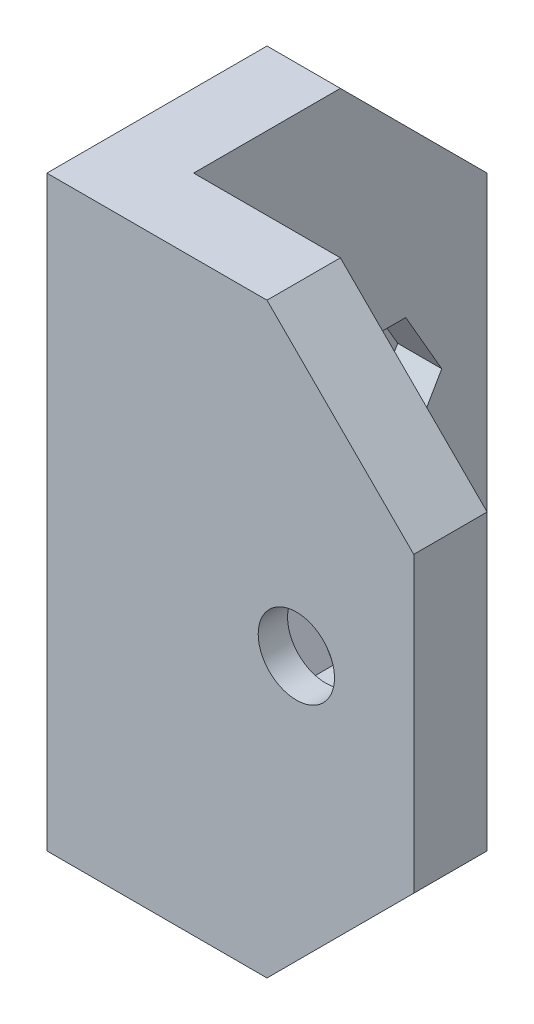
ISO-10303-21;
HEADER;
FILE_DESCRIPTION(('STEP AP214'),'2;1');
FILE_NAME('part.step','',(''),(''),'','','');
FILE_SCHEMA(('AUTOMOTIVE_DESIGN { 1 0 10303 214 1 1 1 1 }'));
ENDSEC;
DATA;
#1=APPLICATION_CONTEXT('core data for automotive mechanical design processes');
#2=APPLICATION_PROTOCOL_DEFINITION('international standard','automotive_design',2000,#1);
#3=PRODUCT_CONTEXT('',#1,'mechanical');
#4=PRODUCT('Part','Part','',(#3));
#5=PRODUCT_RELATED_PRODUCT_CATEGORY('part','',(#4));
#6=PRODUCT_DEFINITION_FORMATION('','',#4);
#7=PRODUCT_DEFINITION_CONTEXT('part definition',#1,'design');
#8=PRODUCT_DEFINITION('design','',#6,#7);
#9=PRODUCT_DEFINITION_SHAPE('','',#8);
#10=(LENGTH_UNIT() NAMED_UNIT(*) SI_UNIT(.MILLI.,.METRE.));
#11=(NAMED_UNIT(*) PLANE_ANGLE_UNIT() SI_UNIT($,.RADIAN.));
#12=(NAMED_UNIT(*) SI_UNIT($,.STERADIAN.) SOLID_ANGLE_UNIT());
#13=UNCERTAINTY_MEASURE_WITH_UNIT(LENGTH_MEASURE(1.E-05),#10,'distance_accuracy_value','');
#14=(GEOMETRIC_REPRESENTATION_CONTEXT(3) GLOBAL_UNCERTAINTY_ASSIGNED_CONTEXT((#13)) GLOBAL_UNIT_ASSIGNED_CONTEXT((#10,
#11,#12)) REPRESENTATION_CONTEXT('',''));
#15=CARTESIAN_POINT('',(0.,0.,0.));
#16=DIRECTION('',(0.,0.,1.));
#17=DIRECTION('',(1.,0.,0.));
#18=AXIS2_PLACEMENT_3D('',#15,#16,#17);
#19=CARTESIAN_POINT('',(0.,20.,-17.));
#20=DIRECTION('',(1.,0.,0.));
#21=DIRECTION('',(0.,0.,-1.));
#22=AXIS2_PLACEMENT_3D('',#19,#20,#21);
#23=CYLINDRICAL_SURFACE('',#22,2.6);
#24=CARTESIAN_POINT('',(0.,20.,-17.));
#25=DIRECTION('',(1.,0.,0.));
#26=DIRECTION('',(0.,0.,-1.));
#27=AXIS2_PLACEMENT_3D('',#24,#25,#26);
#28=CIRCLE('',#27,2.6);
#29=CARTESIAN_POINT('',(0.,20.,-19.6));
#30=VERTEX_POINT('',#29);
#31=EDGE_CURVE('E254',#30,#30,#28,.T.);
#32=ORIENTED_EDGE('',*,*,#31,.F.);
#33=EDGE_LOOP('',(#32));
#34=FACE_BOUND('',#33,.T.);
#35=CARTESIAN_POINT('',(2.,20.,-17.));
#36=DIRECTION('',(1.,0.,0.));
#37=DIRECTION('',(0.,0.,-1.));
#38=AXIS2_PLACEMENT_3D('',#35,#36,#37);
#39=CIRCLE('',#38,2.6);
#40=CARTESIAN_POINT('',(2.,20.,-19.6));
#41=VERTEX_POINT('',#40);
#42=EDGE_CURVE('E252',#41,#41,#39,.F.);
#43=ORIENTED_EDGE('',*,*,#42,.F.);
#44=EDGE_LOOP('',(#43));
#45=FACE_BOUND('',#44,.T.);
#46=ADVANCED_FACE('F42',(#34,#45),#23,.F.);
#47=CARTESIAN_POINT('',(17.,20.,35.));
#48=DIRECTION('',(0.,0.,-1.));
#49=DIRECTION('',(-1.,0.,0.));
#50=AXIS2_PLACEMENT_3D('',#47,#48,#49);
#51=CYLINDRICAL_SURFACE('',#50,2.6);
#52=CARTESIAN_POINT('',(17.,20.,0.));
#53=DIRECTION('',(0.,0.,-1.));
#54=DIRECTION('',(-1.,0.,0.));
#55=AXIS2_PLACEMENT_3D('',#52,#53,#54);
#56=CIRCLE('',#55,2.6);
#57=CARTESIAN_POINT('',(14.4,20.,0.));
#58=VERTEX_POINT('',#57);
#59=EDGE_CURVE('E319',#58,#58,#56,.T.);
#60=ORIENTED_EDGE('',*,*,#59,.F.);
#61=EDGE_LOOP('',(#60));
#62=FACE_BOUND('',#61,.T.);
#63=CARTESIAN_POINT('',(17.,20.,-2.));
#64=DIRECTION('',(0.,0.,-1.));
#65=DIRECTION('',(-1.,0.,0.));
#66=AXIS2_PLACEMENT_3D('',#63,#64,#65);
#67=CIRCLE('',#66,2.6);
#68=CARTESIAN_POINT('',(14.4,20.,-2.));
#69=VERTEX_POINT('',#68);
#70=EDGE_CURVE('E318',#69,#69,#67,.F.);
#71=ORIENTED_EDGE('',*,*,#70,.F.);
#72=EDGE_LOOP('',(#71));
#73=FACE_BOUND('',#72,.T.);
#74=ADVANCED_FACE('F477',(#62,#73),#51,.F.);
#75=CARTESIAN_POINT('',(0.,40.,-25.));
#76=DIRECTION('',(1.,0.,0.));
#77=DIRECTION('',(0.,0.,-1.));
#78=AXIS2_PLACEMENT_3D('',#75,#76,#77);
#79=PLANE('',#78);
#80=ORIENTED_EDGE('',*,*,#31,.T.);
#81=EDGE_LOOP('',(#80));
#82=FACE_BOUND('',#81,.T.);
#83=DIRECTION('',(0.,-1.,0.));
#84=VECTOR('',#83,1.);
#85=CARTESIAN_POINT('',(0.,40.,-25.));
#86=LINE('',#85,#84);
#87=CARTESIAN_POINT('',(0.,30.,-25.));
#88=VERTEX_POINT('',#87);
#89=CARTESIAN_POINT('',(0.,10.,-25.));
#90=VERTEX_POINT('',#89);
#91=EDGE_CURVE('E339',#88,#90,#86,.T.);
#92=ORIENTED_EDGE('',*,*,#91,.T.);
#93=DIRECTION('',(0.,0.707106781186546,-0.707106781186549));
#94=VECTOR('',#93,1.);
#95=CARTESIAN_POINT('',(0.,10.,-25.));
#96=LINE('',#95,#94);
#97=CARTESIAN_POINT('',(0.,0.,-15.));
#98=VERTEX_POINT('',#97);
#99=EDGE_CURVE('E421',#90,#98,#96,.F.);
#100=ORIENTED_EDGE('',*,*,#99,.T.);
#101=DIRECTION('',(0.,0.,1.));
#102=VECTOR('',#101,1.);
#103=CARTESIAN_POINT('',(0.,0.,-25.));
#104=LINE('',#103,#102);
#105=CARTESIAN_POINT('',(0.,0.,0.));
#106=VERTEX_POINT('',#105);
#107=EDGE_CURVE('E323',#98,#106,#104,.T.);
#108=ORIENTED_EDGE('',*,*,#107,.T.);
#109=DIRECTION('',(0.,-1.,0.));
#110=VECTOR('',#109,1.);
#111=CARTESIAN_POINT('',(0.,40.,0.));
#112=LINE('',#111,#110);
#113=CARTESIAN_POINT('',(0.,40.,0.));
#114=VERTEX_POINT('',#113);
#115=EDGE_CURVE('E369',#114,#106,#112,.T.);
#116=ORIENTED_EDGE('',*,*,#115,.F.);
#117=DIRECTION('',(0.,0.,1.));
#118=VECTOR('',#117,1.);
#119=CARTESIAN_POINT('',(0.,40.,-25.));
#120=LINE('',#119,#118);
#121=CARTESIAN_POINT('',(0.,40.,-15.));
#122=VERTEX_POINT('',#121);
#123=EDGE_CURVE('E324',#122,#114,#120,.T.);
#124=ORIENTED_EDGE('',*,*,#123,.F.);
#125=DIRECTION('',(0.,-0.707106781186549,-0.707106781186546));
#126=VECTOR('',#125,1.);
#127=CARTESIAN_POINT('',(0.,40.,-15.));
#128=LINE('',#127,#126);
#129=EDGE_CURVE('E418',#122,#88,#128,.T.);
#130=ORIENTED_EDGE('',*,*,#129,.T.);
#131=EDGE_LOOP('',(#92,#100,#108,#116,#124,#130));
#132=FACE_BOUND('',#131,.T.);
#133=ADVANCED_FACE('F434',(#82,#132),#79,.F.);
#134=CARTESIAN_POINT('',(0.,40.,0.));
#135=DIRECTION('',(0.,0.,-1.));
#136=DIRECTION('',(-1.,0.,0.));
#137=AXIS2_PLACEMENT_3D('',#134,#135,#136);
#138=PLANE('',#137);
#139=ORIENTED_EDGE('',*,*,#59,.T.);
#140=EDGE_LOOP('',(#139));
#141=FACE_BOUND('',#140,.T.);
#142=DIRECTION('',(1.,0.,0.));
#143=VECTOR('',#142,1.);
#144=CARTESIAN_POINT('',(0.,0.,0.));
#145=LINE('',#144,#143);
#146=CARTESIAN_POINT('',(15.,0.,0.));
#147=VERTEX_POINT('',#146);
#148=EDGE_CURVE('E342',#106,#147,#145,.T.);
#149=ORIENTED_EDGE('',*,*,#148,.T.);
#150=DIRECTION('',(-0.707106781186549,-0.707106781186546,0.));
#151=VECTOR('',#150,1.);
#152=CARTESIAN_POINT('',(25.,10.,0.));
#153=LINE('',#152,#151);
#154=CARTESIAN_POINT('',(25.,10.,0.));
#155=VERTEX_POINT('',#154);
#156=EDGE_CURVE('E401',#147,#155,#153,.F.);
#157=ORIENTED_EDGE('',*,*,#156,.T.);
#158=DIRECTION('',(0.,-1.,0.));
#159=VECTOR('',#158,1.);
#160=CARTESIAN_POINT('',(25.,40.,0.));
#161=LINE('',#160,#159);
#162=CARTESIAN_POINT('',(25.,30.,0.));
#163=VERTEX_POINT('',#162);
#164=EDGE_CURVE('E365',#163,#155,#161,.T.);
#165=ORIENTED_EDGE('',*,*,#164,.F.);
#166=DIRECTION('',(-0.707106781186546,0.707106781186549,0.));
#167=VECTOR('',#166,1.);
#168=CARTESIAN_POINT('',(15.,40.,0.));
#169=LINE('',#168,#167);
#170=CARTESIAN_POINT('',(15.,40.,0.));
#171=VERTEX_POINT('',#170);
#172=EDGE_CURVE('E398',#163,#171,#169,.T.);
#173=ORIENTED_EDGE('',*,*,#172,.T.);
#174=DIRECTION('',(1.,0.,0.));
#175=VECTOR('',#174,1.);
#176=CARTESIAN_POINT('',(0.,40.,0.));
#177=LINE('',#176,#175);
#178=EDGE_CURVE('E327',#114,#171,#177,.T.);
#179=ORIENTED_EDGE('',*,*,#178,.F.);
#180=ORIENTED_EDGE('',*,*,#115,.T.);
#181=EDGE_LOOP('',(#149,#157,#165,#173,#179,#180));
#182=FACE_BOUND('',#181,.T.);
#183=ADVANCED_FACE('F451',(#141,#182),#138,.F.);
#184=CARTESIAN_POINT('',(25.,40.,0.));
#185=DIRECTION('',(-1.,0.,0.));
#186=DIRECTION('',(0.,0.,1.));
#187=AXIS2_PLACEMENT_3D('',#184,#185,#186);
#188=PLANE('',#187);
#189=ORIENTED_EDGE('',*,*,#164,.T.);
#190=DIRECTION('',(0.,0.,-1.));
#191=VECTOR('',#190,1.);
#192=CARTESIAN_POINT('',(25.,10.,0.));
#193=LINE('',#192,#191);
#194=CARTESIAN_POINT('',(25.,10.,-5.));
#195=VERTEX_POINT('',#194);
#196=EDGE_CURVE('E382',#155,#195,#193,.T.);
#197=ORIENTED_EDGE('',*,*,#196,.T.);
#198=DIRECTION('',(0.,-1.,0.));
#199=VECTOR('',#198,1.);
#200=CARTESIAN_POINT('',(25.,40.,-5.));
#201=LINE('',#200,#199);
#202=CARTESIAN_POINT('',(25.,30.,-5.));
#203=VERTEX_POINT('',#202);
#204=EDGE_CURVE('E361',#203,#195,#201,.T.);
#205=ORIENTED_EDGE('',*,*,#204,.F.);
#206=DIRECTION('',(0.,0.,1.));
#207=VECTOR('',#206,1.);
#208=CARTESIAN_POINT('',(25.,30.,0.));
#209=LINE('',#208,#207);
#210=EDGE_CURVE('E373',#203,#163,#209,.T.);
#211=ORIENTED_EDGE('',*,*,#210,.T.);
#212=EDGE_LOOP('',(#189,#197,#205,#211));
#213=FACE_BOUND('',#212,.T.);
#214=ADVANCED_FACE('F462',(#213),#188,.F.);
#215=CARTESIAN_POINT('',(25.,40.,-5.));
#216=DIRECTION('',(0.,0.,1.));
#217=DIRECTION('',(1.,0.,0.));
#218=AXIS2_PLACEMENT_3D('',#215,#216,#217);
#219=PLANE('',#218);
#220=DIRECTION('',(1.,0.,0.));
#221=VECTOR('',#220,1.);
#222=CARTESIAN_POINT('',(14.5462613559441,24.25,-5.));
#223=LINE('',#222,#221);
#224=CARTESIAN_POINT('',(14.5462613559441,24.25,-5.));
#225=VERTEX_POINT('',#224);
#226=CARTESIAN_POINT('',(19.4537386440559,24.25,-5.));
#227=VERTEX_POINT('',#226);
#228=EDGE_CURVE('E278',#225,#227,#223,.T.);
#229=ORIENTED_EDGE('',*,*,#228,.F.);
#230=DIRECTION('',(0.5,0.866025403784439,0.));
#231=VECTOR('',#230,1.);
#232=CARTESIAN_POINT('',(12.0925227118882,20.,-5.));
#233=LINE('',#232,#231);
#234=CARTESIAN_POINT('',(12.0925227118882,20.,-5.));
#235=VERTEX_POINT('',#234);
#236=EDGE_CURVE('E258',#235,#225,#233,.T.);
#237=ORIENTED_EDGE('',*,*,#236,.F.);
#238=DIRECTION('',(-0.5,0.866025403784439,0.));
#239=VECTOR('',#238,1.);
#240=CARTESIAN_POINT('',(14.5462613559441,15.75,-5.));
#241=LINE('',#240,#239);
#242=CARTESIAN_POINT('',(14.5462613559441,15.75,-5.));
#243=VERTEX_POINT('',#242);
#244=EDGE_CURVE('E294',#243,#235,#241,.T.);
#245=ORIENTED_EDGE('',*,*,#244,.F.);
#246=DIRECTION('',(-1.,0.,0.));
#247=VECTOR('',#246,1.);
#248=CARTESIAN_POINT('',(19.4537386440559,15.75,-5.));
#249=LINE('',#248,#247);
#250=CARTESIAN_POINT('',(19.4537386440559,15.75,-5.));
#251=VERTEX_POINT('',#250);
#252=EDGE_CURVE('E290',#251,#243,#249,.T.);
#253=ORIENTED_EDGE('',*,*,#252,.F.);
#254=DIRECTION('',(-0.5,-0.866025403784439,0.));
#255=VECTOR('',#254,1.);
#256=CARTESIAN_POINT('',(21.9074772881118,20.,-5.));
#257=LINE('',#256,#255);
#258=CARTESIAN_POINT('',(21.9074772881118,20.,-5.));
#259=VERTEX_POINT('',#258);
#260=EDGE_CURVE('E286',#259,#251,#257,.T.);
#261=ORIENTED_EDGE('',*,*,#260,.F.);
#262=DIRECTION('',(0.5,-0.866025403784439,0.));
#263=VECTOR('',#262,1.);
#264=CARTESIAN_POINT('',(19.4537386440559,24.25,-5.));
#265=LINE('',#264,#263);
#266=EDGE_CURVE('E282',#227,#259,#265,.T.);
#267=ORIENTED_EDGE('',*,*,#266,.F.);
#268=EDGE_LOOP('',(#229,#237,#245,#253,#261,#267));
#269=FACE_BOUND('',#268,.T.);
#270=ORIENTED_EDGE('',*,*,#204,.T.);
#271=DIRECTION('',(0.707106781186549,0.707106781186546,0.));
#272=VECTOR('',#271,1.);
#273=CARTESIAN_POINT('',(25.,10.,-5.));
#274=LINE('',#273,#272);
#275=CARTESIAN_POINT('',(15.,0.,-5.));
#276=VERTEX_POINT('',#275);
#277=EDGE_CURVE('E389',#195,#276,#274,.F.);
#278=ORIENTED_EDGE('',*,*,#277,.T.);
#279=DIRECTION('',(-1.,0.,0.));
#280=VECTOR('',#279,1.);
#281=CARTESIAN_POINT('',(25.,0.,-5.));
#282=LINE('',#281,#280);
#283=CARTESIAN_POINT('',(5.,0.,-5.));
#284=VERTEX_POINT('',#283);
#285=EDGE_CURVE('E346',#276,#284,#282,.T.);
#286=ORIENTED_EDGE('',*,*,#285,.T.);
#287=DIRECTION('',(0.,-1.,0.));
#288=VECTOR('',#287,1.);
#289=CARTESIAN_POINT('',(5.,40.,-5.));
#290=LINE('',#289,#288);
#291=CARTESIAN_POINT('',(5.,40.,-5.));
#292=VERTEX_POINT('',#291);
#293=EDGE_CURVE('E357',#292,#284,#290,.T.);
#294=ORIENTED_EDGE('',*,*,#293,.F.);
#295=DIRECTION('',(-1.,0.,0.));
#296=VECTOR('',#295,1.);
#297=CARTESIAN_POINT('',(25.,40.,-5.));
#298=LINE('',#297,#296);
#299=CARTESIAN_POINT('',(15.,40.,-5.));
#300=VERTEX_POINT('',#299);
#301=EDGE_CURVE('E332',#300,#292,#298,.T.);
#302=ORIENTED_EDGE('',*,*,#301,.F.);
#303=DIRECTION('',(0.707106781186546,-0.707106781186549,0.));
#304=VECTOR('',#303,1.);
#305=CARTESIAN_POINT('',(15.,40.,-5.));
#306=LINE('',#305,#304);
#307=EDGE_CURVE('E386',#300,#203,#306,.T.);
#308=ORIENTED_EDGE('',*,*,#307,.T.);
#309=EDGE_LOOP('',(#270,#278,#286,#294,#302,#308));
#310=FACE_BOUND('',#309,.T.);
#311=ADVANCED_FACE('F460',(#269,#310),#219,.F.);
#312=CARTESIAN_POINT('',(5.,40.,-5.));
#313=DIRECTION('',(-1.,0.,0.));
#314=DIRECTION('',(0.,0.,1.));
#315=AXIS2_PLACEMENT_3D('',#312,#313,#314);
#316=PLANE('',#315);
#317=DIRECTION('',(0.,0.,1.));
#318=VECTOR('',#317,1.);
#319=CARTESIAN_POINT('',(5.,24.25,-19.4537386440559));
#320=LINE('',#319,#318);
#321=CARTESIAN_POINT('',(5.,24.25,-19.4537386440559));
#322=VERTEX_POINT('',#321);
#323=CARTESIAN_POINT('',(5.,24.25,-14.5462613559441));
#324=VERTEX_POINT('',#323);
#325=EDGE_CURVE('E210',#322,#324,#320,.T.);
#326=ORIENTED_EDGE('',*,*,#325,.F.);
#327=DIRECTION('',(0.,0.866025403784439,0.5));
#328=VECTOR('',#327,1.);
#329=CARTESIAN_POINT('',(4.99999999999999,20.,-21.9074772881118));
#330=LINE('',#329,#328);
#331=CARTESIAN_POINT('',(4.99999999999999,20.,-21.9074772881118));
#332=VERTEX_POINT('',#331);
#333=EDGE_CURVE('E216',#332,#322,#330,.T.);
#334=ORIENTED_EDGE('',*,*,#333,.F.);
#335=DIRECTION('',(0.,0.866025403784439,-0.5));
#336=VECTOR('',#335,1.);
#337=CARTESIAN_POINT('',(5.,15.75,-19.4537386440559));
#338=LINE('',#337,#336);
#339=CARTESIAN_POINT('',(5.,15.75,-19.4537386440559));
#340=VERTEX_POINT('',#339);
#341=EDGE_CURVE('E232',#340,#332,#338,.T.);
#342=ORIENTED_EDGE('',*,*,#341,.F.);
#343=DIRECTION('',(0.,0.,-1.));
#344=VECTOR('',#343,1.);
#345=CARTESIAN_POINT('',(5.,15.75,-14.5462613559441));
#346=LINE('',#345,#344);
#347=CARTESIAN_POINT('',(5.,15.75,-14.5462613559441));
#348=VERTEX_POINT('',#347);
#349=EDGE_CURVE('E225',#348,#340,#346,.T.);
#350=ORIENTED_EDGE('',*,*,#349,.F.);
#351=DIRECTION('',(0.,-0.866025403784439,-0.5));
#352=VECTOR('',#351,1.);
#353=CARTESIAN_POINT('',(5.,20.,-12.0925227118882));
#354=LINE('',#353,#352);
#355=CARTESIAN_POINT('',(5.,20.,-12.0925227118882));
#356=VERTEX_POINT('',#355);
#357=EDGE_CURVE('E221',#356,#348,#354,.T.);
#358=ORIENTED_EDGE('',*,*,#357,.F.);
#359=DIRECTION('',(0.,-0.866025403784439,0.5));
#360=VECTOR('',#359,1.);
#361=CARTESIAN_POINT('',(5.,24.25,-14.5462613559441));
#362=LINE('',#361,#360);
#363=EDGE_CURVE('E198',#324,#356,#362,.T.);
#364=ORIENTED_EDGE('',*,*,#363,.F.);
#365=EDGE_LOOP('',(#326,#334,#342,#350,#358,#364));
#366=FACE_BOUND('',#365,.T.);
#367=DIRECTION('',(0.,0.,-1.));
#368=VECTOR('',#367,1.);
#369=CARTESIAN_POINT('',(5.,0.,-5.));
#370=LINE('',#369,#368);
#371=CARTESIAN_POINT('',(5.,0.,-15.));
#372=VERTEX_POINT('',#371);
#373=EDGE_CURVE('E328',#284,#372,#370,.T.);
#374=ORIENTED_EDGE('',*,*,#373,.T.);
#375=DIRECTION('',(0.,-0.707106781186546,0.707106781186549));
#376=VECTOR('',#375,1.);
#377=CARTESIAN_POINT('',(4.99999999999999,10.,-25.));
#378=LINE('',#377,#376);
#379=CARTESIAN_POINT('',(4.99999999999999,10.,-25.));
#380=VERTEX_POINT('',#379);
#381=EDGE_CURVE('E12',#372,#380,#378,.F.);
#382=ORIENTED_EDGE('',*,*,#381,.T.);
#383=DIRECTION('',(0.,-1.,0.));
#384=VECTOR('',#383,1.);
#385=CARTESIAN_POINT('',(4.99999999999999,40.,-25.));
#386=LINE('',#385,#384);
#387=CARTESIAN_POINT('',(4.99999999999999,30.,-25.));
#388=VERTEX_POINT('',#387);
#389=EDGE_CURVE('E354',#388,#380,#386,.T.);
#390=ORIENTED_EDGE('',*,*,#389,.F.);
#391=DIRECTION('',(0.,0.707106781186549,0.707106781186546));
#392=VECTOR('',#391,1.);
#393=CARTESIAN_POINT('',(5.,40.,-15.));
#394=LINE('',#393,#392);
#395=CARTESIAN_POINT('',(5.,40.,-15.));
#396=VERTEX_POINT('',#395);
#397=EDGE_CURVE('E52',#388,#396,#394,.T.);
#398=ORIENTED_EDGE('',*,*,#397,.T.);
#399=DIRECTION('',(0.,0.,-1.));
#400=VECTOR('',#399,1.);
#401=CARTESIAN_POINT('',(5.,40.,-5.));
#402=LINE('',#401,#400);
#403=EDGE_CURVE('E335',#292,#396,#402,.T.);
#404=ORIENTED_EDGE('',*,*,#403,.F.);
#405=ORIENTED_EDGE('',*,*,#293,.T.);
#406=EDGE_LOOP('',(#374,#382,#390,#398,#404,#405));
#407=FACE_BOUND('',#406,.T.);
#408=ADVANCED_FACE('F218',(#366,#407),#316,.F.);
#409=CARTESIAN_POINT('',(4.99999999999999,40.,-25.));
#410=DIRECTION('',(0.,0.,1.));
#411=DIRECTION('',(1.,0.,0.));
#412=AXIS2_PLACEMENT_3D('',#409,#410,#411);
#413=PLANE('',#412);
#414=ORIENTED_EDGE('',*,*,#389,.T.);
#415=DIRECTION('',(-1.,0.,0.));
#416=VECTOR('',#415,1.);
#417=CARTESIAN_POINT('',(4.99999999999999,10.,-25.));
#418=LINE('',#417,#416);
#419=EDGE_CURVE('E414',#380,#90,#418,.T.);
#420=ORIENTED_EDGE('',*,*,#419,.T.);
#421=ORIENTED_EDGE('',*,*,#91,.F.);
#422=DIRECTION('',(1.,0.,0.));
#423=VECTOR('',#422,1.);
#424=CARTESIAN_POINT('',(4.99999999999999,30.,-25.));
#425=LINE('',#424,#423);
#426=EDGE_CURVE('E64',#88,#388,#425,.T.);
#427=ORIENTED_EDGE('',*,*,#426,.T.);
#428=EDGE_LOOP('',(#414,#420,#421,#427));
#429=FACE_BOUND('',#428,.T.);
#430=ADVANCED_FACE('F436',(#429),#413,.F.);
#431=CARTESIAN_POINT('',(0.,40.,0.));
#432=DIRECTION('',(0.,1.,0.));
#433=DIRECTION('',(0.,0.,1.));
#434=AXIS2_PLACEMENT_3D('',#431,#432,#433);
#435=PLANE('',#434);
#436=ORIENTED_EDGE('',*,*,#178,.T.);
#437=DIRECTION('',(0.,0.,-1.));
#438=VECTOR('',#437,1.);
#439=CARTESIAN_POINT('',(15.,40.,-5.));
#440=LINE('',#439,#438);
#441=EDGE_CURVE('E408',#171,#300,#440,.T.);
#442=ORIENTED_EDGE('',*,*,#441,.T.);
#443=ORIENTED_EDGE('',*,*,#301,.T.);
#444=ORIENTED_EDGE('',*,*,#403,.T.);
#445=DIRECTION('',(-1.,0.,0.));
#446=VECTOR('',#445,1.);
#447=CARTESIAN_POINT('',(0.,40.,-15.));
#448=LINE('',#447,#446);
#449=EDGE_CURVE('E404',#396,#122,#448,.T.);
#450=ORIENTED_EDGE('',*,*,#449,.T.);
#451=ORIENTED_EDGE('',*,*,#123,.T.);
#452=EDGE_LOOP('',(#436,#442,#443,#444,#450,#451));
#453=FACE_BOUND('',#452,.T.);
#454=ADVANCED_FACE('F429',(#453),#435,.T.);
#455=CARTESIAN_POINT('',(0.,0.,0.));
#456=DIRECTION('',(0.,1.,0.));
#457=DIRECTION('',(0.,0.,1.));
#458=AXIS2_PLACEMENT_3D('',#455,#456,#457);
#459=PLANE('',#458);
#460=ORIENTED_EDGE('',*,*,#285,.F.);
#461=DIRECTION('',(0.,0.,1.));
#462=VECTOR('',#461,1.);
#463=CARTESIAN_POINT('',(15.,0.,0.));
#464=LINE('',#463,#462);
#465=EDGE_CURVE('E395',#276,#147,#464,.T.);
#466=ORIENTED_EDGE('',*,*,#465,.T.);
#467=ORIENTED_EDGE('',*,*,#148,.F.);
#468=ORIENTED_EDGE('',*,*,#107,.F.);
#469=DIRECTION('',(1.,0.,0.));
#470=VECTOR('',#469,1.);
#471=CARTESIAN_POINT('',(0.,0.,-15.));
#472=LINE('',#471,#470);
#473=EDGE_CURVE('E392',#98,#372,#472,.T.);
#474=ORIENTED_EDGE('',*,*,#473,.T.);
#475=ORIENTED_EDGE('',*,*,#373,.F.);
#476=EDGE_LOOP('',(#460,#466,#467,#468,#474,#475));
#477=FACE_BOUND('',#476,.T.);
#478=ADVANCED_FACE('F445',(#477),#459,.F.);
#479=CARTESIAN_POINT('',(0.,40.,-2.));
#480=DIRECTION('',(0.,0.,-1.));
#481=DIRECTION('',(-1.,0.,0.));
#482=AXIS2_PLACEMENT_3D('',#479,#480,#481);
#483=PLANE('',#482);
#484=DIRECTION('',(-0.5,-0.866025403784439,0.));
#485=VECTOR('',#484,1.);
#486=CARTESIAN_POINT('',(12.0925227118882,20.,-2.));
#487=LINE('',#486,#485);
#488=CARTESIAN_POINT('',(14.5462613559441,24.25,-2.));
#489=VERTEX_POINT('',#488);
#490=CARTESIAN_POINT('',(12.0925227118882,20.,-2.));
#491=VERTEX_POINT('',#490);
#492=EDGE_CURVE('E272',#489,#491,#487,.T.);
#493=ORIENTED_EDGE('',*,*,#492,.F.);
#494=DIRECTION('',(-1.,0.,0.));
#495=VECTOR('',#494,1.);
#496=CARTESIAN_POINT('',(14.5462613559441,24.25,-2.));
#497=LINE('',#496,#495);
#498=CARTESIAN_POINT('',(19.4537386440559,24.25,-2.));
#499=VERTEX_POINT('',#498);
#500=EDGE_CURVE('E275',#499,#489,#497,.T.);
#501=ORIENTED_EDGE('',*,*,#500,.F.);
#502=DIRECTION('',(-0.5,0.866025403784439,0.));
#503=VECTOR('',#502,1.);
#504=CARTESIAN_POINT('',(19.4537386440559,24.25,-2.));
#505=LINE('',#504,#503);
#506=CARTESIAN_POINT('',(21.9074772881118,20.,-2.));
#507=VERTEX_POINT('',#506);
#508=EDGE_CURVE('E259',#507,#499,#505,.T.);
#509=ORIENTED_EDGE('',*,*,#508,.F.);
#510=DIRECTION('',(0.5,0.866025403784439,0.));
#511=VECTOR('',#510,1.);
#512=CARTESIAN_POINT('',(21.9074772881118,20.,-2.));
#513=LINE('',#512,#511);
#514=CARTESIAN_POINT('',(19.4537386440559,15.75,-2.));
#515=VERTEX_POINT('',#514);
#516=EDGE_CURVE('E262',#515,#507,#513,.T.);
#517=ORIENTED_EDGE('',*,*,#516,.F.);
#518=DIRECTION('',(1.,0.,0.));
#519=VECTOR('',#518,1.);
#520=CARTESIAN_POINT('',(19.4537386440559,15.75,-2.));
#521=LINE('',#520,#519);
#522=CARTESIAN_POINT('',(14.5462613559441,15.75,-2.));
#523=VERTEX_POINT('',#522);
#524=EDGE_CURVE('E266',#523,#515,#521,.T.);
#525=ORIENTED_EDGE('',*,*,#524,.F.);
#526=DIRECTION('',(0.5,-0.866025403784439,0.));
#527=VECTOR('',#526,1.);
#528=CARTESIAN_POINT('',(14.5462613559441,15.75,-2.));
#529=LINE('',#528,#527);
#530=EDGE_CURVE('E269',#491,#523,#529,.T.);
#531=ORIENTED_EDGE('',*,*,#530,.F.);
#532=EDGE_LOOP('',(#493,#501,#509,#517,#525,#531));
#533=FACE_BOUND('',#532,.T.);
#534=ORIENTED_EDGE('',*,*,#70,.T.);
#535=EDGE_LOOP('',(#534));
#536=FACE_BOUND('',#535,.T.);
#537=ADVANCED_FACE('F490',(#533,#536),#483,.T.);
#538=CARTESIAN_POINT('',(12.0925227118882,20.,12.9839644690415));
#539=DIRECTION('',(-0.866025403784439,0.5,0.));
#540=DIRECTION('',(-0.5,-0.866025403784439,0.));
#541=AXIS2_PLACEMENT_3D('',#538,#539,#540);
#542=PLANE('',#541);
#543=ORIENTED_EDGE('',*,*,#492,.T.);
#544=DIRECTION('',(0.,0.,-1.));
#545=VECTOR('',#544,1.);
#546=CARTESIAN_POINT('',(12.0925227118882,20.,12.9839644690415));
#547=LINE('',#546,#545);
#548=EDGE_CURVE('E263',#491,#235,#547,.T.);
#549=ORIENTED_EDGE('',*,*,#548,.T.);
#550=ORIENTED_EDGE('',*,*,#236,.T.);
#551=DIRECTION('',(0.,0.,-1.));
#552=VECTOR('',#551,1.);
#553=CARTESIAN_POINT('',(14.5462613559441,24.25,12.9839644690415));
#554=LINE('',#553,#552);
#555=EDGE_CURVE('E298',#489,#225,#554,.T.);
#556=ORIENTED_EDGE('',*,*,#555,.F.);
#557=EDGE_LOOP('',(#543,#549,#550,#556));
#558=FACE_BOUND('',#557,.T.);
#559=ADVANCED_FACE('F493',(#558),#542,.F.);
#560=CARTESIAN_POINT('',(14.5462613559441,15.75,12.9839644690415));
#561=DIRECTION('',(-0.866025403784439,-0.5,0.));
#562=DIRECTION('',(0.5,-0.866025403784439,0.));
#563=AXIS2_PLACEMENT_3D('',#560,#561,#562);
#564=PLANE('',#563);
#565=ORIENTED_EDGE('',*,*,#530,.T.);
#566=DIRECTION('',(0.,0.,-1.));
#567=VECTOR('',#566,1.);
#568=CARTESIAN_POINT('',(14.5462613559441,15.75,12.9839644690415));
#569=LINE('',#568,#567);
#570=EDGE_CURVE('E301',#523,#243,#569,.T.);
#571=ORIENTED_EDGE('',*,*,#570,.T.);
#572=ORIENTED_EDGE('',*,*,#244,.T.);
#573=ORIENTED_EDGE('',*,*,#548,.F.);
#574=EDGE_LOOP('',(#565,#571,#572,#573));
#575=FACE_BOUND('',#574,.T.);
#576=ADVANCED_FACE('F495',(#575),#564,.F.);
#577=CARTESIAN_POINT('',(19.4537386440559,15.75,12.9839644690415));
#578=DIRECTION('',(0.,-1.,0.));
#579=DIRECTION('',(0.,0.,-1.));
#580=AXIS2_PLACEMENT_3D('',#577,#578,#579);
#581=PLANE('',#580);
#582=ORIENTED_EDGE('',*,*,#524,.T.);
#583=DIRECTION('',(0.,0.,-1.));
#584=VECTOR('',#583,1.);
#585=CARTESIAN_POINT('',(19.4537386440559,15.75,12.9839644690415));
#586=LINE('',#585,#584);
#587=EDGE_CURVE('E304',#515,#251,#586,.T.);
#588=ORIENTED_EDGE('',*,*,#587,.T.);
#589=ORIENTED_EDGE('',*,*,#252,.T.);
#590=ORIENTED_EDGE('',*,*,#570,.F.);
#591=EDGE_LOOP('',(#582,#588,#589,#590));
#592=FACE_BOUND('',#591,.T.);
#593=ADVANCED_FACE('F498',(#592),#581,.F.);
#594=CARTESIAN_POINT('',(21.9074772881118,20.,12.9839644690415));
#595=DIRECTION('',(0.866025403784439,-0.5,0.));
#596=DIRECTION('',(0.5,0.866025403784439,0.));
#597=AXIS2_PLACEMENT_3D('',#594,#595,#596);
#598=PLANE('',#597);
#599=ORIENTED_EDGE('',*,*,#516,.T.);
#600=DIRECTION('',(0.,0.,-1.));
#601=VECTOR('',#600,1.);
#602=CARTESIAN_POINT('',(21.9074772881118,20.,12.9839644690415));
#603=LINE('',#602,#601);
#604=EDGE_CURVE('E307',#507,#259,#603,.T.);
#605=ORIENTED_EDGE('',*,*,#604,.T.);
#606=ORIENTED_EDGE('',*,*,#260,.T.);
#607=ORIENTED_EDGE('',*,*,#587,.F.);
#608=EDGE_LOOP('',(#599,#605,#606,#607));
#609=FACE_BOUND('',#608,.T.);
#610=ADVANCED_FACE('F502',(#609),#598,.F.);
#611=CARTESIAN_POINT('',(19.4537386440559,24.25,12.9839644690415));
#612=DIRECTION('',(0.866025403784439,0.5,0.));
#613=DIRECTION('',(-0.5,0.866025403784439,0.));
#614=AXIS2_PLACEMENT_3D('',#611,#612,#613);
#615=PLANE('',#614);
#616=ORIENTED_EDGE('',*,*,#508,.T.);
#617=DIRECTION('',(0.,0.,-1.));
#618=VECTOR('',#617,1.);
#619=CARTESIAN_POINT('',(19.4537386440559,24.25,12.9839644690415));
#620=LINE('',#619,#618);
#621=EDGE_CURVE('E310',#499,#227,#620,.T.);
#622=ORIENTED_EDGE('',*,*,#621,.T.);
#623=ORIENTED_EDGE('',*,*,#266,.T.);
#624=ORIENTED_EDGE('',*,*,#604,.F.);
#625=EDGE_LOOP('',(#616,#622,#623,#624));
#626=FACE_BOUND('',#625,.T.);
#627=ADVANCED_FACE('F506',(#626),#615,.F.);
#628=CARTESIAN_POINT('',(14.5462613559441,24.25,12.9839644690415));
#629=DIRECTION('',(0.,1.,0.));
#630=DIRECTION('',(0.,0.,1.));
#631=AXIS2_PLACEMENT_3D('',#628,#629,#630);
#632=PLANE('',#631);
#633=ORIENTED_EDGE('',*,*,#500,.T.);
#634=ORIENTED_EDGE('',*,*,#555,.T.);
#635=ORIENTED_EDGE('',*,*,#228,.T.);
#636=ORIENTED_EDGE('',*,*,#621,.F.);
#637=EDGE_LOOP('',(#633,#634,#635,#636));
#638=FACE_BOUND('',#637,.T.);
#639=ADVANCED_FACE('F510',(#638),#632,.F.);
#640=CARTESIAN_POINT('',(1.99999999999999,40.,-25.));
#641=DIRECTION('',(1.,0.,0.));
#642=DIRECTION('',(0.,0.,-1.));
#643=AXIS2_PLACEMENT_3D('',#640,#641,#642);
#644=PLANE('',#643);
#645=DIRECTION('',(0.,-0.866025403784439,-0.5));
#646=VECTOR('',#645,1.);
#647=CARTESIAN_POINT('',(1.99999999999999,20.,-21.9074772881118));
#648=LINE('',#647,#646);
#649=CARTESIAN_POINT('',(1.99999999999999,24.25,-19.4537386440559));
#650=VERTEX_POINT('',#649);
#651=CARTESIAN_POINT('',(1.99999999999999,20.,-21.9074772881118));
#652=VERTEX_POINT('',#651);
#653=EDGE_CURVE('E253',#650,#652,#648,.T.);
#654=ORIENTED_EDGE('',*,*,#653,.F.);
#655=DIRECTION('',(0.,0.,-1.));
#656=VECTOR('',#655,1.);
#657=CARTESIAN_POINT('',(1.99999999999999,24.25,-19.4537386440559));
#658=LINE('',#657,#656);
#659=CARTESIAN_POINT('',(1.99999999999999,24.25,-14.5462613559441));
#660=VERTEX_POINT('',#659);
#661=EDGE_CURVE('E249',#660,#650,#658,.T.);
#662=ORIENTED_EDGE('',*,*,#661,.F.);
#663=DIRECTION('',(0.,0.866025403784439,-0.5));
#664=VECTOR('',#663,1.);
#665=CARTESIAN_POINT('',(2.,24.25,-14.5462613559441));
#666=LINE('',#665,#664);
#667=CARTESIAN_POINT('',(2.,20.,-12.0925227118882));
#668=VERTEX_POINT('',#667);
#669=EDGE_CURVE('E201',#668,#660,#666,.T.);
#670=ORIENTED_EDGE('',*,*,#669,.F.);
#671=DIRECTION('',(0.,0.866025403784439,0.5));
#672=VECTOR('',#671,1.);
#673=CARTESIAN_POINT('',(2.,20.,-12.0925227118882));
#674=LINE('',#673,#672);
#675=CARTESIAN_POINT('',(2.,15.75,-14.5462613559441));
#676=VERTEX_POINT('',#675);
#677=EDGE_CURVE('E733',#676,#668,#674,.T.);
#678=ORIENTED_EDGE('',*,*,#677,.F.);
#679=DIRECTION('',(0.,0.,1.));
#680=VECTOR('',#679,1.);
#681=CARTESIAN_POINT('',(2.,15.75,-14.5462613559441));
#682=LINE('',#681,#680);
#683=CARTESIAN_POINT('',(2.,15.75,-19.4537386440559));
#684=VERTEX_POINT('',#683);
#685=EDGE_CURVE('E736',#684,#676,#682,.T.);
#686=ORIENTED_EDGE('',*,*,#685,.F.);
#687=DIRECTION('',(0.,-0.866025403784439,0.5));
#688=VECTOR('',#687,1.);
#689=CARTESIAN_POINT('',(1.99999999999999,15.75,-19.4537386440559));
#690=LINE('',#689,#688);
#691=EDGE_CURVE('E745',#652,#684,#690,.T.);
#692=ORIENTED_EDGE('',*,*,#691,.F.);
#693=EDGE_LOOP('',(#654,#662,#670,#678,#686,#692));
#694=FACE_BOUND('',#693,.T.);
#695=ORIENTED_EDGE('',*,*,#42,.T.);
#696=EDGE_LOOP('',(#695));
#697=FACE_BOUND('',#696,.T.);
#698=ADVANCED_FACE('F514',(#694,#697),#644,.T.);
#699=CARTESIAN_POINT('',(-12.9839644690416,20.,-21.9074772881118));
#700=DIRECTION('',(0.,0.5,-0.866025403784439));
#701=DIRECTION('',(0.,0.866025403784439,0.5));
#702=AXIS2_PLACEMENT_3D('',#699,#700,#701);
#703=PLANE('',#702);
#704=ORIENTED_EDGE('',*,*,#653,.T.);
#705=DIRECTION('',(1.,0.,0.));
#706=VECTOR('',#705,1.);
#707=CARTESIAN_POINT('',(-12.9839644690416,20.,-21.9074772881118));
#708=LINE('',#707,#706);
#709=EDGE_CURVE('E236',#652,#332,#708,.T.);
#710=ORIENTED_EDGE('',*,*,#709,.T.);
#711=ORIENTED_EDGE('',*,*,#333,.T.);
#712=DIRECTION('',(1.,0.,0.));
#713=VECTOR('',#712,1.);
#714=CARTESIAN_POINT('',(-12.9839644690416,24.25,-19.4537386440559));
#715=LINE('',#714,#713);
#716=EDGE_CURVE('E206',#650,#322,#715,.T.);
#717=ORIENTED_EDGE('',*,*,#716,.F.);
#718=EDGE_LOOP('',(#704,#710,#711,#717));
#719=FACE_BOUND('',#718,.T.);
#720=ADVANCED_FACE('F489',(#719),#703,.F.);
#721=CARTESIAN_POINT('',(-12.9839644690416,15.75,-19.4537386440559));
#722=DIRECTION('',(0.,-0.5,-0.866025403784439));
#723=DIRECTION('',(0.,0.866025403784439,-0.5));
#724=AXIS2_PLACEMENT_3D('',#721,#722,#723);
#725=PLANE('',#724);
#726=ORIENTED_EDGE('',*,*,#691,.T.);
#727=DIRECTION('',(1.,0.,0.));
#728=VECTOR('',#727,1.);
#729=CARTESIAN_POINT('',(-12.9839644690416,15.75,-19.4537386440559));
#730=LINE('',#729,#728);
#731=EDGE_CURVE('E239',#684,#340,#730,.T.);
#732=ORIENTED_EDGE('',*,*,#731,.T.);
#733=ORIENTED_EDGE('',*,*,#341,.T.);
#734=ORIENTED_EDGE('',*,*,#709,.F.);
#735=EDGE_LOOP('',(#726,#732,#733,#734));
#736=FACE_BOUND('',#735,.T.);
#737=ADVANCED_FACE('F610',(#736),#725,.F.);
#738=CARTESIAN_POINT('',(-12.9839644690416,15.75,-14.5462613559441));
#739=DIRECTION('',(0.,-1.,0.));
#740=DIRECTION('',(0.,0.,-1.));
#741=AXIS2_PLACEMENT_3D('',#738,#739,#740);
#742=PLANE('',#741);
#743=ORIENTED_EDGE('',*,*,#685,.T.);
#744=DIRECTION('',(1.,0.,0.));
#745=VECTOR('',#744,1.);
#746=CARTESIAN_POINT('',(-12.9839644690416,15.75,-14.5462613559441));
#747=LINE('',#746,#745);
#748=EDGE_CURVE('E242',#676,#348,#747,.T.);
#749=ORIENTED_EDGE('',*,*,#748,.T.);
#750=ORIENTED_EDGE('',*,*,#349,.T.);
#751=ORIENTED_EDGE('',*,*,#731,.F.);
#752=EDGE_LOOP('',(#743,#749,#750,#751));
#753=FACE_BOUND('',#752,.T.);
#754=ADVANCED_FACE('F617',(#753),#742,.F.);
#755=CARTESIAN_POINT('',(-12.9839644690416,20.,-12.0925227118882));
#756=DIRECTION('',(0.,-0.5,0.866025403784439));
#757=DIRECTION('',(0.,-0.866025403784439,-0.5));
#758=AXIS2_PLACEMENT_3D('',#755,#756,#757);
#759=PLANE('',#758);
#760=ORIENTED_EDGE('',*,*,#677,.T.);
#761=DIRECTION('',(1.,0.,0.));
#762=VECTOR('',#761,1.);
#763=CARTESIAN_POINT('',(-12.9839644690416,20.,-12.0925227118882));
#764=LINE('',#763,#762);
#765=EDGE_CURVE('E205',#668,#356,#764,.T.);
#766=ORIENTED_EDGE('',*,*,#765,.T.);
#767=ORIENTED_EDGE('',*,*,#357,.T.);
#768=ORIENTED_EDGE('',*,*,#748,.F.);
#769=EDGE_LOOP('',(#760,#766,#767,#768));
#770=FACE_BOUND('',#769,.T.);
#771=ADVANCED_FACE('F625',(#770),#759,.F.);
#772=CARTESIAN_POINT('',(-12.9839644690416,24.25,-14.5462613559441));
#773=DIRECTION('',(0.,0.5,0.866025403784439));
#774=DIRECTION('',(0.,-0.866025403784439,0.5));
#775=AXIS2_PLACEMENT_3D('',#772,#773,#774);
#776=PLANE('',#775);
#777=ORIENTED_EDGE('',*,*,#669,.T.);
#778=DIRECTION('',(1.,0.,0.));
#779=VECTOR('',#778,1.);
#780=CARTESIAN_POINT('',(-12.9839644690416,24.25,-14.5462613559441));
#781=LINE('',#780,#779);
#782=EDGE_CURVE('E193',#660,#324,#781,.T.);
#783=ORIENTED_EDGE('',*,*,#782,.T.);
#784=ORIENTED_EDGE('',*,*,#363,.T.);
#785=ORIENTED_EDGE('',*,*,#765,.F.);
#786=EDGE_LOOP('',(#777,#783,#784,#785));
#787=FACE_BOUND('',#786,.T.);
#788=ADVANCED_FACE('F195',(#787),#776,.F.);
#789=CARTESIAN_POINT('',(-12.9839644690416,24.25,-19.4537386440559));
#790=DIRECTION('',(0.,1.,0.));
#791=DIRECTION('',(0.,0.,1.));
#792=AXIS2_PLACEMENT_3D('',#789,#790,#791);
#793=PLANE('',#792);
#794=ORIENTED_EDGE('',*,*,#661,.T.);
#795=ORIENTED_EDGE('',*,*,#716,.T.);
#796=ORIENTED_EDGE('',*,*,#325,.T.);
#797=ORIENTED_EDGE('',*,*,#782,.F.);
#798=EDGE_LOOP('',(#794,#795,#796,#797));
#799=FACE_BOUND('',#798,.T.);
#800=ADVANCED_FACE('F211',(#799),#793,.F.);
#801=CARTESIAN_POINT('',(25.,10.,0.));
#802=DIRECTION('',(-0.707106781186546,0.707106781186549,0.));
#803=DIRECTION('',(0.,0.,-1.));
#804=AXIS2_PLACEMENT_3D('',#801,#802,#803);
#805=PLANE('',#804);
#806=ORIENTED_EDGE('',*,*,#156,.F.);
#807=ORIENTED_EDGE('',*,*,#465,.F.);
#808=ORIENTED_EDGE('',*,*,#277,.F.);
#809=ORIENTED_EDGE('',*,*,#196,.F.);
#810=EDGE_LOOP('',(#806,#807,#808,#809));
#811=FACE_BOUND('',#810,.T.);
#812=ADVANCED_FACE('F465',(#811),#805,.F.);
#813=CARTESIAN_POINT('',(15.,40.,0.));
#814=DIRECTION('',(0.707106781186549,0.707106781186546,0.));
#815=DIRECTION('',(0.,0.,1.));
#816=AXIS2_PLACEMENT_3D('',#813,#814,#815);
#817=PLANE('',#816);
#818=ORIENTED_EDGE('',*,*,#172,.F.);
#819=ORIENTED_EDGE('',*,*,#210,.F.);
#820=ORIENTED_EDGE('',*,*,#307,.F.);
#821=ORIENTED_EDGE('',*,*,#441,.F.);
#822=EDGE_LOOP('',(#818,#819,#820,#821));
#823=FACE_BOUND('',#822,.T.);
#824=ADVANCED_FACE('F456',(#823),#817,.T.);
#825=CARTESIAN_POINT('',(4.99999999999999,10.,-25.));
#826=DIRECTION('',(0.,0.707106781186549,0.707106781186546));
#827=DIRECTION('',(-1.,0.,0.));
#828=AXIS2_PLACEMENT_3D('',#825,#826,#827);
#829=PLANE('',#828);
#830=ORIENTED_EDGE('',*,*,#381,.F.);
#831=ORIENTED_EDGE('',*,*,#473,.F.);
#832=ORIENTED_EDGE('',*,*,#99,.F.);
#833=ORIENTED_EDGE('',*,*,#419,.F.);
#834=EDGE_LOOP('',(#830,#831,#832,#833));
#835=FACE_BOUND('',#834,.T.);
#836=ADVANCED_FACE('F439',(#835),#829,.F.);
#837=CARTESIAN_POINT('',(0.,40.,-15.));
#838=DIRECTION('',(0.,0.707106781186546,-0.707106781186549));
#839=DIRECTION('',(1.,0.,0.));
#840=AXIS2_PLACEMENT_3D('',#837,#838,#839);
#841=PLANE('',#840);
#842=ORIENTED_EDGE('',*,*,#397,.F.);
#843=ORIENTED_EDGE('',*,*,#426,.F.);
#844=ORIENTED_EDGE('',*,*,#129,.F.);
#845=ORIENTED_EDGE('',*,*,#449,.F.);
#846=EDGE_LOOP('',(#842,#843,#844,#845));
#847=FACE_BOUND('',#846,.T.);
#848=ADVANCED_FACE('F45',(#847),#841,.T.);
#849=CLOSED_SHELL('',(#46,#74,#133,#183,#214,#311,#408,#430,#454,#478,#537,#559,#576,#593,#610,
#627,#639,#698,#720,#737,#754,#771,#788,#800,#812,#824,#836,#848));
#850=MANIFOLD_SOLID_BREP('B2',#849);
#851=ADVANCED_BREP_SHAPE_REPRESENTATION('',(#18,#850),#14);
#852=SHAPE_DEFINITION_REPRESENTATION(#9,#851);
ENDSEC;
END-ISO-10303-21;
